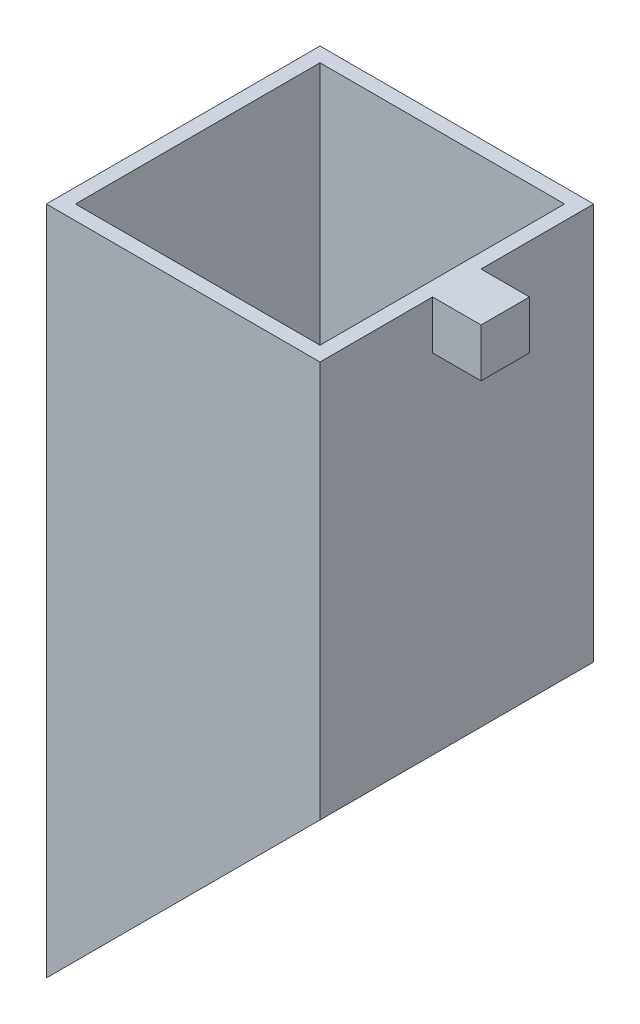
ISO-10303-21;
HEADER;
FILE_DESCRIPTION(('STEP AP214'),'2;1');
FILE_NAME('part.step','',(''),(''),'','','');
FILE_SCHEMA(('AUTOMOTIVE_DESIGN { 1 0 10303 214 1 1 1 1 }'));
ENDSEC;
DATA;
#1=APPLICATION_CONTEXT('core data for automotive mechanical design processes');
#2=APPLICATION_PROTOCOL_DEFINITION('international standard','automotive_design',2000,#1);
#3=PRODUCT_CONTEXT('',#1,'mechanical');
#4=PRODUCT('Part','Part','',(#3));
#5=PRODUCT_RELATED_PRODUCT_CATEGORY('part','',(#4));
#6=PRODUCT_DEFINITION_FORMATION('','',#4);
#7=PRODUCT_DEFINITION_CONTEXT('part definition',#1,'design');
#8=PRODUCT_DEFINITION('design','',#6,#7);
#9=PRODUCT_DEFINITION_SHAPE('','',#8);
#10=(LENGTH_UNIT() NAMED_UNIT(*) SI_UNIT(.MILLI.,.METRE.));
#11=(NAMED_UNIT(*) PLANE_ANGLE_UNIT() SI_UNIT($,.RADIAN.));
#12=(NAMED_UNIT(*) SI_UNIT($,.STERADIAN.) SOLID_ANGLE_UNIT());
#13=UNCERTAINTY_MEASURE_WITH_UNIT(LENGTH_MEASURE(1.E-05),#10,'distance_accuracy_value','');
#14=(GEOMETRIC_REPRESENTATION_CONTEXT(3) GLOBAL_UNCERTAINTY_ASSIGNED_CONTEXT((#13)) GLOBAL_UNIT_ASSIGNED_CONTEXT((#10,
#11,#12)) REPRESENTATION_CONTEXT('',''));
#15=CARTESIAN_POINT('',(0.,0.,0.));
#16=DIRECTION('',(0.,0.,1.));
#17=DIRECTION('',(1.,0.,0.));
#18=AXIS2_PLACEMENT_3D('',#15,#16,#17);
#19=CARTESIAN_POINT('',(56.5,81.9,0.));
#20=DIRECTION('',(-1.,0.,0.));
#21=DIRECTION('',(0.,0.,1.));
#22=AXIS2_PLACEMENT_3D('',#19,#20,#21);
#23=PLANE('',#22);
#24=DIRECTION('',(0.,1.,0.));
#25=VECTOR('',#24,1.);
#26=CARTESIAN_POINT('',(56.5,71.9,-33.25));
#27=LINE('',#26,#25);
#28=CARTESIAN_POINT('',(56.5,71.9,-33.25));
#29=VERTEX_POINT('',#28);
#30=CARTESIAN_POINT('',(56.5,81.9,-33.25));
#31=VERTEX_POINT('',#30);
#32=EDGE_CURVE('E143',#29,#31,#27,.T.);
#33=ORIENTED_EDGE('',*,*,#32,.F.);
#34=DIRECTION('',(0.,0.,1.));
#35=VECTOR('',#34,1.);
#36=CARTESIAN_POINT('',(56.5,71.9,-33.25));
#37=LINE('',#36,#35);
#38=CARTESIAN_POINT('',(56.5,71.9,-23.25));
#39=VERTEX_POINT('',#38);
#40=EDGE_CURVE('E136',#29,#39,#37,.T.);
#41=ORIENTED_EDGE('',*,*,#40,.T.);
#42=DIRECTION('',(0.,1.,0.));
#43=VECTOR('',#42,1.);
#44=CARTESIAN_POINT('',(56.5,71.9,-23.25));
#45=LINE('',#44,#43);
#46=CARTESIAN_POINT('',(56.5,81.9,-23.25));
#47=VERTEX_POINT('',#46);
#48=EDGE_CURVE('E121',#39,#47,#45,.T.);
#49=ORIENTED_EDGE('',*,*,#48,.T.);
#50=DIRECTION('',(0.,0.,-1.));
#51=VECTOR('',#50,1.);
#52=CARTESIAN_POINT('',(56.5,81.9,0.));
#53=LINE('',#52,#51);
#54=CARTESIAN_POINT('',(56.5,81.9,0.));
#55=VERTEX_POINT('',#54);
#56=EDGE_CURVE('E203',#55,#47,#53,.T.);
#57=ORIENTED_EDGE('',*,*,#56,.F.);
#58=DIRECTION('',(0.,-1.,0.));
#59=VECTOR('',#58,1.);
#60=CARTESIAN_POINT('',(56.5,81.9,0.));
#61=LINE('',#60,#59);
#62=CARTESIAN_POINT('',(56.5,0.,0.));
#63=VERTEX_POINT('',#62);
#64=EDGE_CURVE('E43',#55,#63,#61,.T.);
#65=ORIENTED_EDGE('',*,*,#64,.T.);
#66=DIRECTION('',(0.,0.,-1.));
#67=VECTOR('',#66,1.);
#68=CARTESIAN_POINT('',(56.5,0.,0.));
#69=LINE('',#68,#67);
#70=CARTESIAN_POINT('',(56.5,0.,-56.5));
#71=VERTEX_POINT('',#70);
#72=EDGE_CURVE('E192',#63,#71,#69,.T.);
#73=ORIENTED_EDGE('',*,*,#72,.T.);
#74=DIRECTION('',(0.,-1.,0.));
#75=VECTOR('',#74,1.);
#76=CARTESIAN_POINT('',(56.5,81.9,-56.5));
#77=LINE('',#76,#75);
#78=CARTESIAN_POINT('',(56.5,81.9,-56.5));
#79=VERTEX_POINT('',#78);
#80=EDGE_CURVE('E211',#79,#71,#77,.T.);
#81=ORIENTED_EDGE('',*,*,#80,.F.);
#82=EDGE_CURVE('E202',#31,#79,#53,.T.);
#83=ORIENTED_EDGE('',*,*,#82,.F.);
#84=EDGE_LOOP('',(#33,#41,#49,#57,#65,#73,#81,#83));
#85=FACE_BOUND('',#84,.T.);
#86=ADVANCED_FACE('F35',(#85),#23,.F.);
#87=CARTESIAN_POINT('',(0.,81.9,0.));
#88=DIRECTION('',(0.,-1.,0.));
#89=DIRECTION('',(0.,0.,-1.));
#90=AXIS2_PLACEMENT_3D('',#87,#88,#89);
#91=PLANE('',#90);
#92=DIRECTION('',(0.,0.,1.));
#93=VECTOR('',#92,1.);
#94=CARTESIAN_POINT('',(0.,81.9,0.));
#95=LINE('',#94,#93);
#96=CARTESIAN_POINT('',(0.,81.9,-56.5));
#97=VERTEX_POINT('',#96);
#98=CARTESIAN_POINT('',(0.,81.9,0.));
#99=VERTEX_POINT('',#98);
#100=EDGE_CURVE('E197',#97,#99,#95,.T.);
#101=ORIENTED_EDGE('',*,*,#100,.T.);
#102=DIRECTION('',(1.,0.,0.));
#103=VECTOR('',#102,1.);
#104=CARTESIAN_POINT('',(0.,81.9,0.));
#105=LINE('',#104,#103);
#106=EDGE_CURVE('E200',#99,#55,#105,.T.);
#107=ORIENTED_EDGE('',*,*,#106,.T.);
#108=ORIENTED_EDGE('',*,*,#56,.T.);
#109=DIRECTION('',(1.,0.,0.));
#110=VECTOR('',#109,1.);
#111=CARTESIAN_POINT('',(66.5,81.9,-23.25));
#112=LINE('',#111,#110);
#113=CARTESIAN_POINT('',(66.5,81.9,-23.25));
#114=VERTEX_POINT('',#113);
#115=EDGE_CURVE('E50',#47,#114,#112,.T.);
#116=ORIENTED_EDGE('',*,*,#115,.T.);
#117=DIRECTION('',(0.,0.,-1.));
#118=VECTOR('',#117,1.);
#119=CARTESIAN_POINT('',(66.5,81.9,-33.25));
#120=LINE('',#119,#118);
#121=CARTESIAN_POINT('',(66.5,81.9,-33.25));
#122=VERTEX_POINT('',#121);
#123=EDGE_CURVE('E147',#114,#122,#120,.T.);
#124=ORIENTED_EDGE('',*,*,#123,.T.);
#125=DIRECTION('',(-1.,0.,0.));
#126=VECTOR('',#125,1.);
#127=CARTESIAN_POINT('',(66.5,81.9,-33.25));
#128=LINE('',#127,#126);
#129=EDGE_CURVE('E144',#122,#31,#128,.T.);
#130=ORIENTED_EDGE('',*,*,#129,.T.);
#131=ORIENTED_EDGE('',*,*,#82,.T.);
#132=DIRECTION('',(-1.,0.,0.));
#133=VECTOR('',#132,1.);
#134=CARTESIAN_POINT('',(0.,81.9,-56.5));
#135=LINE('',#134,#133);
#136=EDGE_CURVE('E205',#79,#97,#135,.T.);
#137=ORIENTED_EDGE('',*,*,#136,.T.);
#138=EDGE_LOOP('',(#101,#107,#108,#116,#124,#130,#131,#137));
#139=FACE_BOUND('',#138,.T.);
#140=DIRECTION('',(0.,0.,1.));
#141=VECTOR('',#140,1.);
#142=CARTESIAN_POINT('',(3.,81.9,0.));
#143=LINE('',#142,#141);
#144=CARTESIAN_POINT('',(2.99999999999999,81.9,-53.5));
#145=VERTEX_POINT('',#144);
#146=CARTESIAN_POINT('',(3.,81.9,-3.));
#147=VERTEX_POINT('',#146);
#148=EDGE_CURVE('E180',#145,#147,#143,.T.);
#149=ORIENTED_EDGE('',*,*,#148,.F.);
#150=DIRECTION('',(-1.,0.,0.));
#151=VECTOR('',#150,1.);
#152=CARTESIAN_POINT('',(0.,81.9,-53.5));
#153=LINE('',#152,#151);
#154=CARTESIAN_POINT('',(53.5,81.9,-53.5));
#155=VERTEX_POINT('',#154);
#156=EDGE_CURVE('E162',#155,#145,#153,.T.);
#157=ORIENTED_EDGE('',*,*,#156,.F.);
#158=DIRECTION('',(0.,0.,-1.));
#159=VECTOR('',#158,1.);
#160=CARTESIAN_POINT('',(53.5,81.9,0.));
#161=LINE('',#160,#159);
#162=CARTESIAN_POINT('',(53.5,81.9,-3.));
#163=VERTEX_POINT('',#162);
#164=EDGE_CURVE('E186',#163,#155,#161,.T.);
#165=ORIENTED_EDGE('',*,*,#164,.F.);
#166=DIRECTION('',(1.,0.,0.));
#167=VECTOR('',#166,1.);
#168=CARTESIAN_POINT('',(0.,81.9,-3.));
#169=LINE('',#168,#167);
#170=EDGE_CURVE('E184',#147,#163,#169,.T.);
#171=ORIENTED_EDGE('',*,*,#170,.F.);
#172=EDGE_LOOP('',(#149,#157,#165,#171));
#173=FACE_BOUND('',#172,.T.);
#174=ADVANCED_FACE('F231',(#139,#173),#91,.F.);
#175=CARTESIAN_POINT('',(0.,-56.4999999999994,-136.403066274079));
#176=DIRECTION('',(0.707106781186544,-0.707106781186551,0.));
#177=DIRECTION('',(0.707106781186551,0.707106781186544,0.));
#178=AXIS2_PLACEMENT_3D('',#175,#176,#177);
#179=PLANE('',#178);
#180=DIRECTION('',(-0.707106781186551,-0.707106781186544,0.));
#181=VECTOR('',#180,1.);
#182=CARTESIAN_POINT('',(0.,-56.4999999999994,-56.5));
#183=LINE('',#182,#181);
#184=CARTESIAN_POINT('',(0.,-56.4999999999994,-56.5));
#185=VERTEX_POINT('',#184);
#186=EDGE_CURVE('E189',#71,#185,#183,.T.);
#187=ORIENTED_EDGE('',*,*,#186,.F.);
#188=ORIENTED_EDGE('',*,*,#72,.F.);
#189=DIRECTION('',(0.707106781186551,0.707106781186544,0.));
#190=VECTOR('',#189,1.);
#191=CARTESIAN_POINT('',(0.,-56.4999999999994,0.));
#192=LINE('',#191,#190);
#193=CARTESIAN_POINT('',(0.,-56.4999999999994,0.));
#194=VERTEX_POINT('',#193);
#195=EDGE_CURVE('E166',#194,#63,#192,.T.);
#196=ORIENTED_EDGE('',*,*,#195,.F.);
#197=DIRECTION('',(0.,0.,1.));
#198=VECTOR('',#197,1.);
#199=CARTESIAN_POINT('',(0.,-56.4999999999994,-136.403066274079));
#200=LINE('',#199,#198);
#201=EDGE_CURVE('E193',#185,#194,#200,.T.);
#202=ORIENTED_EDGE('',*,*,#201,.F.);
#203=EDGE_LOOP('',(#187,#188,#196,#202));
#204=FACE_BOUND('',#203,.T.);
#205=DIRECTION('',(0.,0.,-1.));
#206=VECTOR('',#205,1.);
#207=CARTESIAN_POINT('',(53.5,-2.99999999999998,-136.403066274079));
#208=LINE('',#207,#206);
#209=CARTESIAN_POINT('',(53.5,-2.99999999999997,-3.));
#210=VERTEX_POINT('',#209);
#211=CARTESIAN_POINT('',(53.5,-2.99999999999997,-53.5));
#212=VERTEX_POINT('',#211);
#213=EDGE_CURVE('E177',#210,#212,#208,.T.);
#214=ORIENTED_EDGE('',*,*,#213,.T.);
#215=DIRECTION('',(-0.707106781186551,-0.707106781186544,0.));
#216=VECTOR('',#215,1.);
#217=CARTESIAN_POINT('',(0.,-56.4999999999994,-53.5));
#218=LINE('',#217,#216);
#219=CARTESIAN_POINT('',(2.99999999999999,-53.4999999999995,-53.5));
#220=VERTEX_POINT('',#219);
#221=EDGE_CURVE('E174',#212,#220,#218,.T.);
#222=ORIENTED_EDGE('',*,*,#221,.T.);
#223=DIRECTION('',(0.,0.,1.));
#224=VECTOR('',#223,1.);
#225=CARTESIAN_POINT('',(2.99999999999998,-53.4999999999995,-136.403066274079));
#226=LINE('',#225,#224);
#227=CARTESIAN_POINT('',(3.,-53.4999999999994,-3.));
#228=VERTEX_POINT('',#227);
#229=EDGE_CURVE('E171',#220,#228,#226,.T.);
#230=ORIENTED_EDGE('',*,*,#229,.T.);
#231=DIRECTION('',(0.707106781186551,0.707106781186544,0.));
#232=VECTOR('',#231,1.);
#233=CARTESIAN_POINT('',(0.,-56.4999999999994,-3.));
#234=LINE('',#233,#232);
#235=EDGE_CURVE('E156',#228,#210,#234,.T.);
#236=ORIENTED_EDGE('',*,*,#235,.T.);
#237=EDGE_LOOP('',(#214,#222,#230,#236));
#238=FACE_BOUND('',#237,.T.);
#239=ADVANCED_FACE('F223',(#204,#238),#179,.T.);
#240=CARTESIAN_POINT('',(0.,81.9,0.));
#241=DIRECTION('',(1.,0.,0.));
#242=DIRECTION('',(0.,0.,-1.));
#243=AXIS2_PLACEMENT_3D('',#240,#241,#242);
#244=PLANE('',#243);
#245=DIRECTION('',(0.,-1.,0.));
#246=VECTOR('',#245,1.);
#247=CARTESIAN_POINT('',(0.,81.9,-56.5));
#248=LINE('',#247,#246);
#249=EDGE_CURVE('E207',#97,#185,#248,.T.);
#250=ORIENTED_EDGE('',*,*,#249,.T.);
#251=ORIENTED_EDGE('',*,*,#201,.T.);
#252=DIRECTION('',(0.,-1.,0.));
#253=VECTOR('',#252,1.);
#254=CARTESIAN_POINT('',(0.,81.9,0.));
#255=LINE('',#254,#253);
#256=EDGE_CURVE('E11',#99,#194,#255,.T.);
#257=ORIENTED_EDGE('',*,*,#256,.F.);
#258=ORIENTED_EDGE('',*,*,#100,.F.);
#259=EDGE_LOOP('',(#250,#251,#257,#258));
#260=FACE_BOUND('',#259,.T.);
#261=ADVANCED_FACE('F37',(#260),#244,.F.);
#262=CARTESIAN_POINT('',(0.,81.9,0.));
#263=DIRECTION('',(0.,0.,-1.));
#264=DIRECTION('',(-1.,0.,0.));
#265=AXIS2_PLACEMENT_3D('',#262,#263,#264);
#266=PLANE('',#265);
#267=ORIENTED_EDGE('',*,*,#256,.T.);
#268=ORIENTED_EDGE('',*,*,#195,.T.);
#269=ORIENTED_EDGE('',*,*,#64,.F.);
#270=ORIENTED_EDGE('',*,*,#106,.F.);
#271=EDGE_LOOP('',(#267,#268,#269,#270));
#272=FACE_BOUND('',#271,.T.);
#273=ADVANCED_FACE('F218',(#272),#266,.F.);
#274=CARTESIAN_POINT('',(0.,81.9,-56.5));
#275=DIRECTION('',(0.,0.,1.));
#276=DIRECTION('',(1.,0.,0.));
#277=AXIS2_PLACEMENT_3D('',#274,#275,#276);
#278=PLANE('',#277);
#279=ORIENTED_EDGE('',*,*,#80,.T.);
#280=ORIENTED_EDGE('',*,*,#186,.T.);
#281=ORIENTED_EDGE('',*,*,#249,.F.);
#282=ORIENTED_EDGE('',*,*,#136,.F.);
#283=EDGE_LOOP('',(#279,#280,#281,#282));
#284=FACE_BOUND('',#283,.T.);
#285=ADVANCED_FACE('F227',(#284),#278,.F.);
#286=CARTESIAN_POINT('',(3.,81.9,0.));
#287=DIRECTION('',(1.,0.,0.));
#288=DIRECTION('',(0.,0.,-1.));
#289=AXIS2_PLACEMENT_3D('',#286,#287,#288);
#290=PLANE('',#289);
#291=DIRECTION('',(0.,-1.,0.));
#292=VECTOR('',#291,1.);
#293=CARTESIAN_POINT('',(2.99999999999999,81.9,-53.5));
#294=LINE('',#293,#292);
#295=EDGE_CURVE('E160',#145,#220,#294,.T.);
#296=ORIENTED_EDGE('',*,*,#295,.F.);
#297=ORIENTED_EDGE('',*,*,#148,.T.);
#298=DIRECTION('',(0.,-1.,0.));
#299=VECTOR('',#298,1.);
#300=CARTESIAN_POINT('',(3.,81.9,-3.));
#301=LINE('',#300,#299);
#302=EDGE_CURVE('E163',#147,#228,#301,.T.);
#303=ORIENTED_EDGE('',*,*,#302,.T.);
#304=ORIENTED_EDGE('',*,*,#229,.F.);
#305=EDGE_LOOP('',(#296,#297,#303,#304));
#306=FACE_BOUND('',#305,.T.);
#307=ADVANCED_FACE('F254',(#306),#290,.T.);
#308=CARTESIAN_POINT('',(0.,81.9,-3.));
#309=DIRECTION('',(0.,0.,-1.));
#310=DIRECTION('',(-1.,0.,0.));
#311=AXIS2_PLACEMENT_3D('',#308,#309,#310);
#312=PLANE('',#311);
#313=ORIENTED_EDGE('',*,*,#302,.F.);
#314=ORIENTED_EDGE('',*,*,#170,.T.);
#315=DIRECTION('',(0.,-1.,0.));
#316=VECTOR('',#315,1.);
#317=CARTESIAN_POINT('',(53.5,81.9,-3.));
#318=LINE('',#317,#316);
#319=EDGE_CURVE('E167',#163,#210,#318,.T.);
#320=ORIENTED_EDGE('',*,*,#319,.T.);
#321=ORIENTED_EDGE('',*,*,#235,.F.);
#322=EDGE_LOOP('',(#313,#314,#320,#321));
#323=FACE_BOUND('',#322,.T.);
#324=ADVANCED_FACE('F262',(#323),#312,.T.);
#325=CARTESIAN_POINT('',(53.5,81.9,0.));
#326=DIRECTION('',(-1.,0.,0.));
#327=DIRECTION('',(0.,0.,1.));
#328=AXIS2_PLACEMENT_3D('',#325,#326,#327);
#329=PLANE('',#328);
#330=ORIENTED_EDGE('',*,*,#213,.F.);
#331=ORIENTED_EDGE('',*,*,#319,.F.);
#332=ORIENTED_EDGE('',*,*,#164,.T.);
#333=DIRECTION('',(0.,-1.,0.));
#334=VECTOR('',#333,1.);
#335=CARTESIAN_POINT('',(53.5,81.9,-53.5));
#336=LINE('',#335,#334);
#337=EDGE_CURVE('E58',#155,#212,#336,.T.);
#338=ORIENTED_EDGE('',*,*,#337,.T.);
#339=EDGE_LOOP('',(#330,#331,#332,#338));
#340=FACE_BOUND('',#339,.T.);
#341=ADVANCED_FACE('F259',(#340),#329,.T.);
#342=CARTESIAN_POINT('',(0.,81.9,-53.5));
#343=DIRECTION('',(0.,0.,1.));
#344=DIRECTION('',(1.,0.,0.));
#345=AXIS2_PLACEMENT_3D('',#342,#343,#344);
#346=PLANE('',#345);
#347=ORIENTED_EDGE('',*,*,#337,.F.);
#348=ORIENTED_EDGE('',*,*,#156,.T.);
#349=ORIENTED_EDGE('',*,*,#295,.T.);
#350=ORIENTED_EDGE('',*,*,#221,.F.);
#351=EDGE_LOOP('',(#347,#348,#349,#350));
#352=FACE_BOUND('',#351,.T.);
#353=ADVANCED_FACE('F256',(#352),#346,.T.);
#354=CARTESIAN_POINT('',(66.5,71.9,-33.25));
#355=DIRECTION('',(0.,0.,-1.));
#356=DIRECTION('',(-1.,0.,0.));
#357=AXIS2_PLACEMENT_3D('',#354,#355,#356);
#358=PLANE('',#357);
#359=ORIENTED_EDGE('',*,*,#129,.F.);
#360=DIRECTION('',(0.,1.,0.));
#361=VECTOR('',#360,1.);
#362=CARTESIAN_POINT('',(66.5,71.9,-33.25));
#363=LINE('',#362,#361);
#364=CARTESIAN_POINT('',(66.5,71.9,-33.25));
#365=VERTEX_POINT('',#364);
#366=EDGE_CURVE('E157',#365,#122,#363,.T.);
#367=ORIENTED_EDGE('',*,*,#366,.F.);
#368=DIRECTION('',(-1.,0.,0.));
#369=VECTOR('',#368,1.);
#370=CARTESIAN_POINT('',(66.5,71.9,-33.25));
#371=LINE('',#370,#369);
#372=EDGE_CURVE('E130',#365,#29,#371,.T.);
#373=ORIENTED_EDGE('',*,*,#372,.T.);
#374=ORIENTED_EDGE('',*,*,#32,.T.);
#375=EDGE_LOOP('',(#359,#367,#373,#374));
#376=FACE_BOUND('',#375,.T.);
#377=ADVANCED_FACE('F236',(#376),#358,.T.);
#378=CARTESIAN_POINT('',(66.5,71.9,-33.25));
#379=DIRECTION('',(1.,0.,0.));
#380=DIRECTION('',(0.,0.,-1.));
#381=AXIS2_PLACEMENT_3D('',#378,#379,#380);
#382=PLANE('',#381);
#383=ORIENTED_EDGE('',*,*,#123,.F.);
#384=DIRECTION('',(0.,1.,0.));
#385=VECTOR('',#384,1.);
#386=CARTESIAN_POINT('',(66.5,71.9,-23.25));
#387=LINE('',#386,#385);
#388=CARTESIAN_POINT('',(66.5,71.9,-23.25));
#389=VERTEX_POINT('',#388);
#390=EDGE_CURVE('E129',#389,#114,#387,.T.);
#391=ORIENTED_EDGE('',*,*,#390,.F.);
#392=DIRECTION('',(0.,0.,-1.));
#393=VECTOR('',#392,1.);
#394=CARTESIAN_POINT('',(66.5,71.9,-33.25));
#395=LINE('',#394,#393);
#396=EDGE_CURVE('E139',#389,#365,#395,.T.);
#397=ORIENTED_EDGE('',*,*,#396,.T.);
#398=ORIENTED_EDGE('',*,*,#366,.T.);
#399=EDGE_LOOP('',(#383,#391,#397,#398));
#400=FACE_BOUND('',#399,.T.);
#401=ADVANCED_FACE('F238',(#400),#382,.T.);
#402=CARTESIAN_POINT('',(66.5,71.9,-23.25));
#403=DIRECTION('',(0.,0.,1.));
#404=DIRECTION('',(1.,0.,0.));
#405=AXIS2_PLACEMENT_3D('',#402,#403,#404);
#406=PLANE('',#405);
#407=ORIENTED_EDGE('',*,*,#115,.F.);
#408=ORIENTED_EDGE('',*,*,#48,.F.);
#409=DIRECTION('',(1.,0.,0.));
#410=VECTOR('',#409,1.);
#411=CARTESIAN_POINT('',(66.5,71.9,-23.25));
#412=LINE('',#411,#410);
#413=EDGE_CURVE('E124',#39,#389,#412,.T.);
#414=ORIENTED_EDGE('',*,*,#413,.T.);
#415=ORIENTED_EDGE('',*,*,#390,.T.);
#416=EDGE_LOOP('',(#407,#408,#414,#415));
#417=FACE_BOUND('',#416,.T.);
#418=ADVANCED_FACE('F123',(#417),#406,.T.);
#419=CARTESIAN_POINT('',(0.,71.9,0.));
#420=DIRECTION('',(0.,-1.,0.));
#421=DIRECTION('',(0.,0.,-1.));
#422=AXIS2_PLACEMENT_3D('',#419,#420,#421);
#423=PLANE('',#422);
#424=ORIENTED_EDGE('',*,*,#40,.F.);
#425=ORIENTED_EDGE('',*,*,#372,.F.);
#426=ORIENTED_EDGE('',*,*,#396,.F.);
#427=ORIENTED_EDGE('',*,*,#413,.F.);
#428=EDGE_LOOP('',(#424,#425,#426,#427));
#429=FACE_BOUND('',#428,.T.);
#430=ADVANCED_FACE('F134',(#429),#423,.T.);
#431=CLOSED_SHELL('',(#86,#174,#239,#261,#273,#285,#307,#324,#341,#353,#377,#401,#418,#430));
#432=MANIFOLD_SOLID_BREP('B2',#431);
#433=ADVANCED_BREP_SHAPE_REPRESENTATION('',(#18,#432),#14);
#434=SHAPE_DEFINITION_REPRESENTATION(#9,#433);
ENDSEC;
END-ISO-10303-21;
